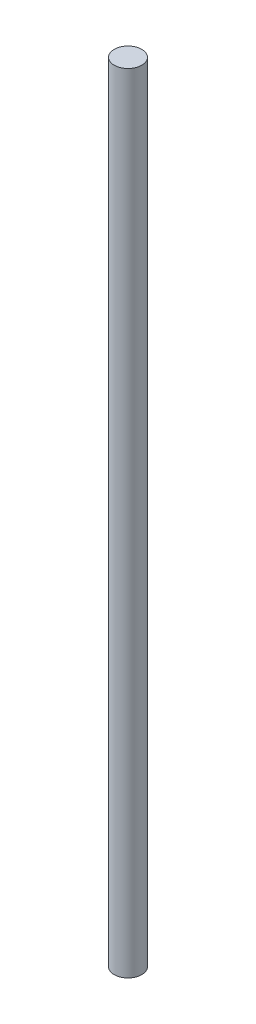
ISO-10303-21;
HEADER;
FILE_DESCRIPTION(('STEP AP214'),'2;1');
FILE_NAME('part.step','',(''),(''),'','','');
FILE_SCHEMA(('AUTOMOTIVE_DESIGN { 1 0 10303 214 1 1 1 1 }'));
ENDSEC;
DATA;
#1=APPLICATION_CONTEXT('core data for automotive mechanical design processes');
#2=APPLICATION_PROTOCOL_DEFINITION('international standard','automotive_design',2000,#1);
#3=PRODUCT_CONTEXT('',#1,'mechanical');
#4=PRODUCT('Part','Part','',(#3));
#5=PRODUCT_RELATED_PRODUCT_CATEGORY('part','',(#4));
#6=PRODUCT_DEFINITION_FORMATION('','',#4);
#7=PRODUCT_DEFINITION_CONTEXT('part definition',#1,'design');
#8=PRODUCT_DEFINITION('design','',#6,#7);
#9=PRODUCT_DEFINITION_SHAPE('','',#8);
#10=(LENGTH_UNIT() NAMED_UNIT(*) SI_UNIT(.MILLI.,.METRE.));
#11=(NAMED_UNIT(*) PLANE_ANGLE_UNIT() SI_UNIT($,.RADIAN.));
#12=(NAMED_UNIT(*) SI_UNIT($,.STERADIAN.) SOLID_ANGLE_UNIT());
#13=UNCERTAINTY_MEASURE_WITH_UNIT(LENGTH_MEASURE(1.E-05),#10,'distance_accuracy_value','');
#14=(GEOMETRIC_REPRESENTATION_CONTEXT(3) GLOBAL_UNCERTAINTY_ASSIGNED_CONTEXT((#13)) GLOBAL_UNIT_ASSIGNED_CONTEXT((#10,
#11,#12)) REPRESENTATION_CONTEXT('',''));
#15=CARTESIAN_POINT('',(0.,0.,0.));
#16=DIRECTION('',(0.,0.,1.));
#17=DIRECTION('',(1.,0.,0.));
#18=AXIS2_PLACEMENT_3D('',#15,#16,#17);
#19=CARTESIAN_POINT('',(0.,40.,0.));
#20=DIRECTION('',(0.,-1.,0.));
#21=DIRECTION('',(0.,0.,-1.));
#22=AXIS2_PLACEMENT_3D('',#19,#20,#21);
#23=CYLINDRICAL_SURFACE('',#22,0.7);
#24=CARTESIAN_POINT('',(0.,40.,0.));
#25=DIRECTION('',(0.,1.,0.));
#26=DIRECTION('',(0.,0.,1.));
#27=AXIS2_PLACEMENT_3D('',#24,#25,#26);
#28=CIRCLE('',#27,0.7);
#29=CARTESIAN_POINT('',(0.,40.,0.7));
#30=VERTEX_POINT('',#29);
#31=EDGE_CURVE('E10',#30,#30,#28,.T.);
#32=ORIENTED_EDGE('',*,*,#31,.F.);
#33=EDGE_LOOP('',(#32));
#34=FACE_BOUND('',#33,.T.);
#35=CARTESIAN_POINT('',(0.,0.,0.));
#36=DIRECTION('',(0.,1.,0.));
#37=DIRECTION('',(0.,0.,1.));
#38=AXIS2_PLACEMENT_3D('',#35,#36,#37);
#39=CIRCLE('',#38,0.7);
#40=CARTESIAN_POINT('',(0.,0.,0.7));
#41=VERTEX_POINT('',#40);
#42=EDGE_CURVE('E32',#41,#41,#39,.T.);
#43=ORIENTED_EDGE('',*,*,#42,.T.);
#44=EDGE_LOOP('',(#43));
#45=FACE_BOUND('',#44,.T.);
#46=ADVANCED_FACE('F29',(#34,#45),#23,.T.);
#47=CARTESIAN_POINT('',(0.,40.,0.));
#48=DIRECTION('',(0.,1.,0.));
#49=DIRECTION('',(0.,0.,1.));
#50=AXIS2_PLACEMENT_3D('',#47,#48,#49);
#51=PLANE('',#50);
#52=ORIENTED_EDGE('',*,*,#31,.T.);
#53=EDGE_LOOP('',(#52));
#54=FACE_BOUND('',#53,.T.);
#55=ADVANCED_FACE('F44',(#54),#51,.T.);
#56=CARTESIAN_POINT('',(0.,0.,0.));
#57=DIRECTION('',(0.,1.,0.));
#58=DIRECTION('',(0.,0.,1.));
#59=AXIS2_PLACEMENT_3D('',#56,#57,#58);
#60=PLANE('',#59);
#61=ORIENTED_EDGE('',*,*,#42,.F.);
#62=EDGE_LOOP('',(#61));
#63=FACE_BOUND('',#62,.T.);
#64=ADVANCED_FACE('F42',(#63),#60,.F.);
#65=CLOSED_SHELL('',(#46,#55,#64));
#66=MANIFOLD_SOLID_BREP('B2',#65);
#67=ADVANCED_BREP_SHAPE_REPRESENTATION('',(#18,#66),#14);
#68=SHAPE_DEFINITION_REPRESENTATION(#9,#67);
ENDSEC;
END-ISO-10303-21;
